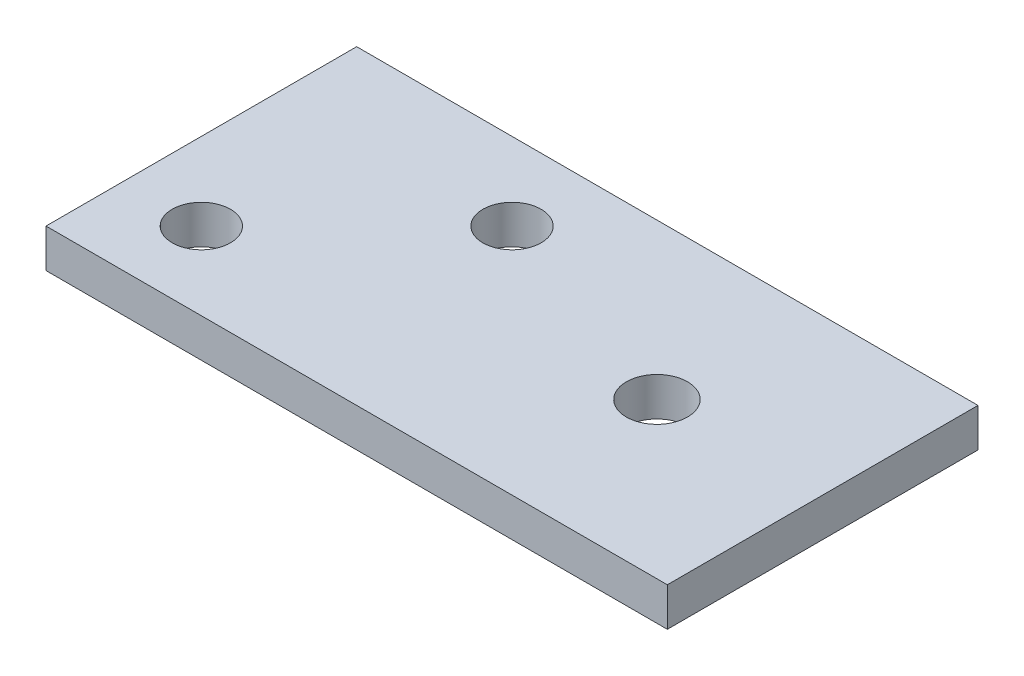
ISO-10303-21;
HEADER;
FILE_DESCRIPTION(('STEP AP214'),'2;1');
FILE_NAME('part.step','',(''),(''),'','','');
FILE_SCHEMA(('AUTOMOTIVE_DESIGN { 1 0 10303 214 1 1 1 1 }'));
ENDSEC;
DATA;
#1=APPLICATION_CONTEXT('core data for automotive mechanical design processes');
#2=APPLICATION_PROTOCOL_DEFINITION('international standard','automotive_design',2000,#1);
#3=PRODUCT_CONTEXT('',#1,'mechanical');
#4=PRODUCT('Part','Part','',(#3));
#5=PRODUCT_RELATED_PRODUCT_CATEGORY('part','',(#4));
#6=PRODUCT_DEFINITION_FORMATION('','',#4);
#7=PRODUCT_DEFINITION_CONTEXT('part definition',#1,'design');
#8=PRODUCT_DEFINITION('design','',#6,#7);
#9=PRODUCT_DEFINITION_SHAPE('','',#8);
#10=(LENGTH_UNIT() NAMED_UNIT(*) SI_UNIT(.MILLI.,.METRE.));
#11=(NAMED_UNIT(*) PLANE_ANGLE_UNIT() SI_UNIT($,.RADIAN.));
#12=(NAMED_UNIT(*) SI_UNIT($,.STERADIAN.) SOLID_ANGLE_UNIT());
#13=UNCERTAINTY_MEASURE_WITH_UNIT(LENGTH_MEASURE(1.E-05),#10,'distance_accuracy_value','');
#14=(GEOMETRIC_REPRESENTATION_CONTEXT(3) GLOBAL_UNCERTAINTY_ASSIGNED_CONTEXT((#13)) GLOBAL_UNIT_ASSIGNED_CONTEXT((#10,
#11,#12)) REPRESENTATION_CONTEXT('',''));
#15=CARTESIAN_POINT('',(0.,0.,0.));
#16=DIRECTION('',(0.,0.,1.));
#17=DIRECTION('',(1.,0.,0.));
#18=AXIS2_PLACEMENT_3D('',#15,#16,#17);
#19=CARTESIAN_POINT('',(50.8,6.31,-25.4));
#20=DIRECTION('',(-1.,0.,0.));
#21=DIRECTION('',(0.,0.,1.));
#22=AXIS2_PLACEMENT_3D('',#19,#20,#21);
#23=PLANE('',#22);
#24=DIRECTION('',(0.,0.,-1.));
#25=VECTOR('',#24,1.);
#26=CARTESIAN_POINT('',(50.8,0.,-25.4));
#27=LINE('',#26,#25);
#28=CARTESIAN_POINT('',(50.8,0.,25.4));
#29=VERTEX_POINT('',#28);
#30=CARTESIAN_POINT('',(50.8,0.,-25.4));
#31=VERTEX_POINT('',#30);
#32=EDGE_CURVE('E97',#29,#31,#27,.T.);
#33=ORIENTED_EDGE('',*,*,#32,.T.);
#34=DIRECTION('',(0.,-1.,0.));
#35=VECTOR('',#34,1.);
#36=CARTESIAN_POINT('',(50.8,6.31,-25.4));
#37=LINE('',#36,#35);
#38=CARTESIAN_POINT('',(50.8,6.31,-25.4));
#39=VERTEX_POINT('',#38);
#40=EDGE_CURVE('E11',#39,#31,#37,.T.);
#41=ORIENTED_EDGE('',*,*,#40,.F.);
#42=DIRECTION('',(0.,0.,-1.));
#43=VECTOR('',#42,1.);
#44=CARTESIAN_POINT('',(50.8,6.31,-25.4));
#45=LINE('',#44,#43);
#46=CARTESIAN_POINT('',(50.8,6.31,25.4));
#47=VERTEX_POINT('',#46);
#48=EDGE_CURVE('E84',#47,#39,#45,.T.);
#49=ORIENTED_EDGE('',*,*,#48,.F.);
#50=DIRECTION('',(0.,-1.,0.));
#51=VECTOR('',#50,1.);
#52=CARTESIAN_POINT('',(50.8,6.31,25.4));
#53=LINE('',#52,#51);
#54=EDGE_CURVE('E93',#47,#29,#53,.T.);
#55=ORIENTED_EDGE('',*,*,#54,.T.);
#56=EDGE_LOOP('',(#33,#41,#49,#55));
#57=FACE_BOUND('',#56,.T.);
#58=ADVANCED_FACE('F32',(#57),#23,.F.);
#59=CARTESIAN_POINT('',(-50.8,6.31,-25.4));
#60=DIRECTION('',(0.,0.,1.));
#61=DIRECTION('',(1.,0.,0.));
#62=AXIS2_PLACEMENT_3D('',#59,#60,#61);
#63=PLANE('',#62);
#64=DIRECTION('',(-1.,0.,0.));
#65=VECTOR('',#64,1.);
#66=CARTESIAN_POINT('',(-50.8,0.,-25.4));
#67=LINE('',#66,#65);
#68=CARTESIAN_POINT('',(-50.8,0.,-25.4));
#69=VERTEX_POINT('',#68);
#70=EDGE_CURVE('E88',#31,#69,#67,.T.);
#71=ORIENTED_EDGE('',*,*,#70,.T.);
#72=DIRECTION('',(0.,-1.,0.));
#73=VECTOR('',#72,1.);
#74=CARTESIAN_POINT('',(-50.8,6.31,-25.4));
#75=LINE('',#74,#73);
#76=CARTESIAN_POINT('',(-50.8,6.31,-25.4));
#77=VERTEX_POINT('',#76);
#78=EDGE_CURVE('E41',#77,#69,#75,.T.);
#79=ORIENTED_EDGE('',*,*,#78,.F.);
#80=DIRECTION('',(-1.,0.,0.));
#81=VECTOR('',#80,1.);
#82=CARTESIAN_POINT('',(-50.8,6.31,-25.4));
#83=LINE('',#82,#81);
#84=EDGE_CURVE('E79',#39,#77,#83,.T.);
#85=ORIENTED_EDGE('',*,*,#84,.F.);
#86=ORIENTED_EDGE('',*,*,#40,.T.);
#87=EDGE_LOOP('',(#71,#79,#85,#86));
#88=FACE_BOUND('',#87,.T.);
#89=ADVANCED_FACE('F87',(#88),#63,.F.);
#90=CARTESIAN_POINT('',(-50.8,6.31,-25.4));
#91=DIRECTION('',(1.,0.,0.));
#92=DIRECTION('',(0.,0.,-1.));
#93=AXIS2_PLACEMENT_3D('',#90,#91,#92);
#94=PLANE('',#93);
#95=DIRECTION('',(0.,0.,1.));
#96=VECTOR('',#95,1.);
#97=CARTESIAN_POINT('',(-50.8,0.,-25.4));
#98=LINE('',#97,#96);
#99=CARTESIAN_POINT('',(-50.8,0.,25.4));
#100=VERTEX_POINT('',#99);
#101=EDGE_CURVE('E66',#69,#100,#98,.T.);
#102=ORIENTED_EDGE('',*,*,#101,.T.);
#103=DIRECTION('',(0.,-1.,0.));
#104=VECTOR('',#103,1.);
#105=CARTESIAN_POINT('',(-50.8,6.31,25.4));
#106=LINE('',#105,#104);
#107=CARTESIAN_POINT('',(-50.8,6.31,25.4));
#108=VERTEX_POINT('',#107);
#109=EDGE_CURVE('E89',#108,#100,#106,.T.);
#110=ORIENTED_EDGE('',*,*,#109,.F.);
#111=DIRECTION('',(0.,0.,1.));
#112=VECTOR('',#111,1.);
#113=CARTESIAN_POINT('',(-50.8,6.31,-25.4));
#114=LINE('',#113,#112);
#115=EDGE_CURVE('E82',#77,#108,#114,.T.);
#116=ORIENTED_EDGE('',*,*,#115,.F.);
#117=ORIENTED_EDGE('',*,*,#78,.T.);
#118=EDGE_LOOP('',(#102,#110,#116,#117));
#119=FACE_BOUND('',#118,.T.);
#120=ADVANCED_FACE('F91',(#119),#94,.F.);
#121=CARTESIAN_POINT('',(-50.8,6.31,25.4));
#122=DIRECTION('',(0.,0.,-1.));
#123=DIRECTION('',(-1.,0.,0.));
#124=AXIS2_PLACEMENT_3D('',#121,#122,#123);
#125=PLANE('',#124);
#126=DIRECTION('',(1.,0.,0.));
#127=VECTOR('',#126,1.);
#128=CARTESIAN_POINT('',(-50.8,0.,25.4));
#129=LINE('',#128,#127);
#130=EDGE_CURVE('E72',#100,#29,#129,.T.);
#131=ORIENTED_EDGE('',*,*,#130,.T.);
#132=ORIENTED_EDGE('',*,*,#54,.F.);
#133=DIRECTION('',(1.,0.,0.));
#134=VECTOR('',#133,1.);
#135=CARTESIAN_POINT('',(-50.8,6.31,25.4));
#136=LINE('',#135,#134);
#137=EDGE_CURVE('E49',#108,#47,#136,.T.);
#138=ORIENTED_EDGE('',*,*,#137,.F.);
#139=ORIENTED_EDGE('',*,*,#109,.T.);
#140=EDGE_LOOP('',(#131,#132,#138,#139));
#141=FACE_BOUND('',#140,.T.);
#142=ADVANCED_FACE('F105',(#141),#125,.F.);
#143=CARTESIAN_POINT('',(0.,6.31,0.));
#144=DIRECTION('',(0.,1.,0.));
#145=DIRECTION('',(0.,0.,1.));
#146=AXIS2_PLACEMENT_3D('',#143,#144,#145);
#147=PLANE('',#146);
#148=CARTESIAN_POINT('',(23.7,6.31,0.));
#149=DIRECTION('',(0.,1.,0.));
#150=DIRECTION('',(0.,0.,1.));
#151=AXIS2_PLACEMENT_3D('',#148,#149,#150);
#152=CIRCLE('',#151,5.);
#153=CARTESIAN_POINT('',(23.7,6.31,5.));
#154=VERTEX_POINT('',#153);
#155=EDGE_CURVE('E122',#154,#154,#152,.T.);
#156=ORIENTED_EDGE('',*,*,#155,.F.);
#157=EDGE_LOOP('',(#156));
#158=FACE_BOUND('',#157,.T.);
#159=CARTESIAN_POINT('',(-12.7,6.31,-12.7));
#160=DIRECTION('',(0.,1.,0.));
#161=DIRECTION('',(0.,0.,1.));
#162=AXIS2_PLACEMENT_3D('',#159,#160,#161);
#163=CIRCLE('',#162,4.7625);
#164=CARTESIAN_POINT('',(-12.7,6.31,-7.9375));
#165=VERTEX_POINT('',#164);
#166=EDGE_CURVE('E117',#165,#165,#163,.T.);
#167=ORIENTED_EDGE('',*,*,#166,.F.);
#168=EDGE_LOOP('',(#167));
#169=FACE_BOUND('',#168,.T.);
#170=CARTESIAN_POINT('',(-38.1,6.31,12.7));
#171=DIRECTION('',(0.,1.,0.));
#172=DIRECTION('',(0.,0.,1.));
#173=AXIS2_PLACEMENT_3D('',#170,#171,#172);
#174=CIRCLE('',#173,4.7625);
#175=CARTESIAN_POINT('',(-38.1,6.31,17.4625));
#176=VERTEX_POINT('',#175);
#177=EDGE_CURVE('E111',#176,#176,#174,.T.);
#178=ORIENTED_EDGE('',*,*,#177,.F.);
#179=EDGE_LOOP('',(#178));
#180=FACE_BOUND('',#179,.T.);
#181=ORIENTED_EDGE('',*,*,#48,.T.);
#182=ORIENTED_EDGE('',*,*,#84,.T.);
#183=ORIENTED_EDGE('',*,*,#115,.T.);
#184=ORIENTED_EDGE('',*,*,#137,.T.);
#185=EDGE_LOOP('',(#181,#182,#183,#184));
#186=FACE_BOUND('',#185,.T.);
#187=ADVANCED_FACE('F80',(#158,#169,#180,#186),#147,.T.);
#188=CARTESIAN_POINT('',(0.,0.,0.));
#189=DIRECTION('',(0.,1.,0.));
#190=DIRECTION('',(0.,0.,1.));
#191=AXIS2_PLACEMENT_3D('',#188,#189,#190);
#192=PLANE('',#191);
#193=CARTESIAN_POINT('',(23.7,0.,0.));
#194=DIRECTION('',(0.,1.,0.));
#195=DIRECTION('',(0.,0.,1.));
#196=AXIS2_PLACEMENT_3D('',#193,#194,#195);
#197=CIRCLE('',#196,5.);
#198=CARTESIAN_POINT('',(23.7,0.,5.));
#199=VERTEX_POINT('',#198);
#200=EDGE_CURVE('E35',#199,#199,#197,.T.);
#201=ORIENTED_EDGE('',*,*,#200,.T.);
#202=EDGE_LOOP('',(#201));
#203=FACE_BOUND('',#202,.T.);
#204=CARTESIAN_POINT('',(-12.7,0.,-12.7));
#205=DIRECTION('',(0.,1.,0.));
#206=DIRECTION('',(0.,0.,1.));
#207=AXIS2_PLACEMENT_3D('',#204,#205,#206);
#208=CIRCLE('',#207,4.7625);
#209=CARTESIAN_POINT('',(-12.7,0.,-7.9375));
#210=VERTEX_POINT('',#209);
#211=EDGE_CURVE('E114',#210,#210,#208,.T.);
#212=ORIENTED_EDGE('',*,*,#211,.T.);
#213=EDGE_LOOP('',(#212));
#214=FACE_BOUND('',#213,.T.);
#215=CARTESIAN_POINT('',(-38.1,0.,12.7));
#216=DIRECTION('',(0.,1.,0.));
#217=DIRECTION('',(0.,0.,1.));
#218=AXIS2_PLACEMENT_3D('',#215,#216,#217);
#219=CIRCLE('',#218,4.7625);
#220=CARTESIAN_POINT('',(-38.1,0.,17.4625));
#221=VERTEX_POINT('',#220);
#222=EDGE_CURVE('E100',#221,#221,#219,.T.);
#223=ORIENTED_EDGE('',*,*,#222,.T.);
#224=EDGE_LOOP('',(#223));
#225=FACE_BOUND('',#224,.T.);
#226=ORIENTED_EDGE('',*,*,#32,.F.);
#227=ORIENTED_EDGE('',*,*,#130,.F.);
#228=ORIENTED_EDGE('',*,*,#101,.F.);
#229=ORIENTED_EDGE('',*,*,#70,.F.);
#230=EDGE_LOOP('',(#226,#227,#228,#229));
#231=FACE_BOUND('',#230,.T.);
#232=ADVANCED_FACE('F108',(#203,#214,#225,#231),#192,.F.);
#233=CARTESIAN_POINT('',(-38.1,0.,12.7));
#234=DIRECTION('',(0.,1.,0.));
#235=DIRECTION('',(0.,0.,1.));
#236=AXIS2_PLACEMENT_3D('',#233,#234,#235);
#237=CYLINDRICAL_SURFACE('',#236,4.7625);
#238=ORIENTED_EDGE('',*,*,#222,.F.);
#239=EDGE_LOOP('',(#238));
#240=FACE_BOUND('',#239,.T.);
#241=ORIENTED_EDGE('',*,*,#177,.T.);
#242=EDGE_LOOP('',(#241));
#243=FACE_BOUND('',#242,.T.);
#244=ADVANCED_FACE('F138',(#240,#243),#237,.F.);
#245=CARTESIAN_POINT('',(-12.7,0.,-12.7));
#246=DIRECTION('',(0.,1.,0.));
#247=DIRECTION('',(0.,0.,1.));
#248=AXIS2_PLACEMENT_3D('',#245,#246,#247);
#249=CYLINDRICAL_SURFACE('',#248,4.7625);
#250=ORIENTED_EDGE('',*,*,#211,.F.);
#251=EDGE_LOOP('',(#250));
#252=FACE_BOUND('',#251,.T.);
#253=ORIENTED_EDGE('',*,*,#166,.T.);
#254=EDGE_LOOP('',(#253));
#255=FACE_BOUND('',#254,.T.);
#256=ADVANCED_FACE('F133',(#252,#255),#249,.F.);
#257=CARTESIAN_POINT('',(23.7,-3.69,0.));
#258=DIRECTION('',(0.,1.,0.));
#259=DIRECTION('',(0.,0.,1.));
#260=AXIS2_PLACEMENT_3D('',#257,#258,#259);
#261=CYLINDRICAL_SURFACE('',#260,5.);
#262=ORIENTED_EDGE('',*,*,#155,.T.);
#263=EDGE_LOOP('',(#262));
#264=FACE_BOUND('',#263,.T.);
#265=ORIENTED_EDGE('',*,*,#200,.F.);
#266=EDGE_LOOP('',(#265));
#267=FACE_BOUND('',#266,.T.);
#268=ADVANCED_FACE('F131',(#264,#267),#261,.F.);
#269=CLOSED_SHELL('',(#58,#89,#120,#142,#187,#232,#244,#256,#268));
#270=MANIFOLD_SOLID_BREP('B2',#269);
#271=ADVANCED_BREP_SHAPE_REPRESENTATION('',(#18,#270),#14);
#272=SHAPE_DEFINITION_REPRESENTATION(#9,#271);
ENDSEC;
END-ISO-10303-21;
